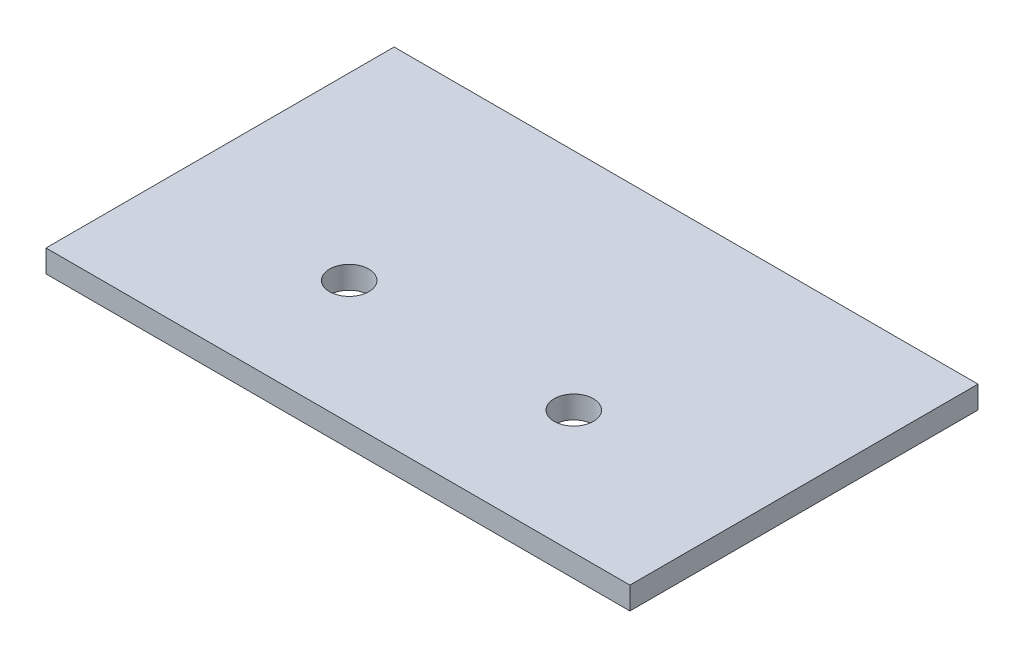
ISO-10303-21;
HEADER;
FILE_DESCRIPTION(('STEP AP214'),'2;1');
FILE_NAME('part.step','',(''),(''),'','','');
FILE_SCHEMA(('AUTOMOTIVE_DESIGN { 1 0 10303 214 1 1 1 1 }'));
ENDSEC;
DATA;
#1=APPLICATION_CONTEXT('core data for automotive mechanical design processes');
#2=APPLICATION_PROTOCOL_DEFINITION('international standard','automotive_design',2000,#1);
#3=PRODUCT_CONTEXT('',#1,'mechanical');
#4=PRODUCT('Part','Part','',(#3));
#5=PRODUCT_RELATED_PRODUCT_CATEGORY('part','',(#4));
#6=PRODUCT_DEFINITION_FORMATION('','',#4);
#7=PRODUCT_DEFINITION_CONTEXT('part definition',#1,'design');
#8=PRODUCT_DEFINITION('design','',#6,#7);
#9=PRODUCT_DEFINITION_SHAPE('','',#8);
#10=(LENGTH_UNIT() NAMED_UNIT(*) SI_UNIT(.MILLI.,.METRE.));
#11=(NAMED_UNIT(*) PLANE_ANGLE_UNIT() SI_UNIT($,.RADIAN.));
#12=(NAMED_UNIT(*) SI_UNIT($,.STERADIAN.) SOLID_ANGLE_UNIT());
#13=UNCERTAINTY_MEASURE_WITH_UNIT(LENGTH_MEASURE(1.E-05),#10,'distance_accuracy_value','');
#14=(GEOMETRIC_REPRESENTATION_CONTEXT(3) GLOBAL_UNCERTAINTY_ASSIGNED_CONTEXT((#13)) GLOBAL_UNIT_ASSIGNED_CONTEXT((#10,
#11,#12)) REPRESENTATION_CONTEXT('',''));
#15=CARTESIAN_POINT('',(0.,0.,0.));
#16=DIRECTION('',(0.,0.,1.));
#17=DIRECTION('',(1.,0.,0.));
#18=AXIS2_PLACEMENT_3D('',#15,#16,#17);
#19=CARTESIAN_POINT('',(0.,2.,0.));
#20=DIRECTION('',(0.,1.,0.));
#21=DIRECTION('',(0.,0.,1.));
#22=AXIS2_PLACEMENT_3D('',#19,#20,#21);
#23=PLANE('',#22);
#24=CARTESIAN_POINT('',(-10.,2.,4.5));
#25=DIRECTION('',(0.,1.,0.));
#26=DIRECTION('',(0.,0.,1.));
#27=AXIS2_PLACEMENT_3D('',#24,#25,#26);
#28=CIRCLE('',#27,1.75);
#29=CARTESIAN_POINT('',(-10.,2.,6.25));
#30=VERTEX_POINT('',#29);
#31=EDGE_CURVE('E99',#30,#30,#28,.T.);
#32=ORIENTED_EDGE('',*,*,#31,.F.);
#33=EDGE_LOOP('',(#32));
#34=FACE_BOUND('',#33,.T.);
#35=DIRECTION('',(0.,0.,-1.));
#36=VECTOR('',#35,1.);
#37=CARTESIAN_POINT('',(26.,2.,-15.5));
#38=LINE('',#37,#36);
#39=CARTESIAN_POINT('',(26.,2.,15.5));
#40=VERTEX_POINT('',#39);
#41=CARTESIAN_POINT('',(26.,2.,-15.5));
#42=VERTEX_POINT('',#41);
#43=EDGE_CURVE('E84',#40,#42,#38,.T.);
#44=ORIENTED_EDGE('',*,*,#43,.T.);
#45=DIRECTION('',(-1.,0.,0.));
#46=VECTOR('',#45,1.);
#47=CARTESIAN_POINT('',(-26.,2.,-15.5));
#48=LINE('',#47,#46);
#49=CARTESIAN_POINT('',(-26.,2.,-15.5));
#50=VERTEX_POINT('',#49);
#51=EDGE_CURVE('E79',#42,#50,#48,.T.);
#52=ORIENTED_EDGE('',*,*,#51,.T.);
#53=DIRECTION('',(0.,0.,1.));
#54=VECTOR('',#53,1.);
#55=CARTESIAN_POINT('',(-26.,2.,-15.5));
#56=LINE('',#55,#54);
#57=CARTESIAN_POINT('',(-26.,2.,15.5));
#58=VERTEX_POINT('',#57);
#59=EDGE_CURVE('E82',#50,#58,#56,.T.);
#60=ORIENTED_EDGE('',*,*,#59,.T.);
#61=DIRECTION('',(1.,0.,0.));
#62=VECTOR('',#61,1.);
#63=CARTESIAN_POINT('',(-26.,2.,15.5));
#64=LINE('',#63,#62);
#65=EDGE_CURVE('E49',#58,#40,#64,.T.);
#66=ORIENTED_EDGE('',*,*,#65,.T.);
#67=EDGE_LOOP('',(#44,#52,#60,#66));
#68=FACE_BOUND('',#67,.T.);
#69=CARTESIAN_POINT('',(10.,2.,4.5));
#70=DIRECTION('',(0.,1.,0.));
#71=DIRECTION('',(0.,0.,1.));
#72=AXIS2_PLACEMENT_3D('',#69,#70,#71);
#73=CIRCLE('',#72,1.75);
#74=CARTESIAN_POINT('',(10.,2.,6.25));
#75=VERTEX_POINT('',#74);
#76=EDGE_CURVE('E114',#75,#75,#73,.T.);
#77=ORIENTED_EDGE('',*,*,#76,.F.);
#78=EDGE_LOOP('',(#77));
#79=FACE_BOUND('',#78,.T.);
#80=ADVANCED_FACE('F32',(#34,#68,#79),#23,.T.);
#81=CARTESIAN_POINT('',(0.,0.,0.));
#82=DIRECTION('',(0.,1.,0.));
#83=DIRECTION('',(0.,0.,1.));
#84=AXIS2_PLACEMENT_3D('',#81,#82,#83);
#85=PLANE('',#84);
#86=DIRECTION('',(0.,0.,-1.));
#87=VECTOR('',#86,1.);
#88=CARTESIAN_POINT('',(26.,0.,-15.5));
#89=LINE('',#88,#87);
#90=CARTESIAN_POINT('',(26.,0.,15.5));
#91=VERTEX_POINT('',#90);
#92=CARTESIAN_POINT('',(26.,0.,-15.5));
#93=VERTEX_POINT('',#92);
#94=EDGE_CURVE('E96',#91,#93,#89,.T.);
#95=ORIENTED_EDGE('',*,*,#94,.F.);
#96=DIRECTION('',(1.,0.,0.));
#97=VECTOR('',#96,1.);
#98=CARTESIAN_POINT('',(-26.,0.,15.5));
#99=LINE('',#98,#97);
#100=CARTESIAN_POINT('',(-26.,0.,15.5));
#101=VERTEX_POINT('',#100);
#102=EDGE_CURVE('E72',#101,#91,#99,.T.);
#103=ORIENTED_EDGE('',*,*,#102,.F.);
#104=DIRECTION('',(0.,0.,1.));
#105=VECTOR('',#104,1.);
#106=CARTESIAN_POINT('',(-26.,0.,-15.5));
#107=LINE('',#106,#105);
#108=CARTESIAN_POINT('',(-26.,0.,-15.5));
#109=VERTEX_POINT('',#108);
#110=EDGE_CURVE('E66',#109,#101,#107,.T.);
#111=ORIENTED_EDGE('',*,*,#110,.F.);
#112=DIRECTION('',(-1.,0.,0.));
#113=VECTOR('',#112,1.);
#114=CARTESIAN_POINT('',(-26.,0.,-15.5));
#115=LINE('',#114,#113);
#116=EDGE_CURVE('E88',#93,#109,#115,.T.);
#117=ORIENTED_EDGE('',*,*,#116,.F.);
#118=EDGE_LOOP('',(#95,#103,#111,#117));
#119=FACE_BOUND('',#118,.T.);
#120=CARTESIAN_POINT('',(-10.,0.,4.5));
#121=DIRECTION('',(0.,1.,0.));
#122=DIRECTION('',(0.,0.,1.));
#123=AXIS2_PLACEMENT_3D('',#120,#121,#122);
#124=CIRCLE('',#123,1.75);
#125=CARTESIAN_POINT('',(-10.,0.,6.25));
#126=VERTEX_POINT('',#125);
#127=EDGE_CURVE('E111',#126,#126,#124,.T.);
#128=ORIENTED_EDGE('',*,*,#127,.T.);
#129=EDGE_LOOP('',(#128));
#130=FACE_BOUND('',#129,.T.);
#131=CARTESIAN_POINT('',(10.,0.,4.5));
#132=DIRECTION('',(0.,1.,0.));
#133=DIRECTION('',(0.,0.,1.));
#134=AXIS2_PLACEMENT_3D('',#131,#132,#133);
#135=CIRCLE('',#134,1.75);
#136=CARTESIAN_POINT('',(10.,0.,6.25));
#137=VERTEX_POINT('',#136);
#138=EDGE_CURVE('E117',#137,#137,#135,.T.);
#139=ORIENTED_EDGE('',*,*,#138,.T.);
#140=EDGE_LOOP('',(#139));
#141=FACE_BOUND('',#140,.T.);
#142=ADVANCED_FACE('F107',(#119,#130,#141),#85,.F.);
#143=CARTESIAN_POINT('',(26.,2.,-15.5));
#144=DIRECTION('',(-1.,0.,0.));
#145=DIRECTION('',(0.,0.,1.));
#146=AXIS2_PLACEMENT_3D('',#143,#144,#145);
#147=PLANE('',#146);
#148=ORIENTED_EDGE('',*,*,#94,.T.);
#149=DIRECTION('',(0.,-1.,0.));
#150=VECTOR('',#149,1.);
#151=CARTESIAN_POINT('',(26.,2.,-15.5));
#152=LINE('',#151,#150);
#153=EDGE_CURVE('E11',#42,#93,#152,.T.);
#154=ORIENTED_EDGE('',*,*,#153,.F.);
#155=ORIENTED_EDGE('',*,*,#43,.F.);
#156=DIRECTION('',(0.,-1.,0.));
#157=VECTOR('',#156,1.);
#158=CARTESIAN_POINT('',(26.,2.,15.5));
#159=LINE('',#158,#157);
#160=EDGE_CURVE('E92',#40,#91,#159,.T.);
#161=ORIENTED_EDGE('',*,*,#160,.T.);
#162=EDGE_LOOP('',(#148,#154,#155,#161));
#163=FACE_BOUND('',#162,.T.);
#164=ADVANCED_FACE('F34',(#163),#147,.F.);
#165=CARTESIAN_POINT('',(-26.,2.,-15.5));
#166=DIRECTION('',(0.,0.,1.));
#167=DIRECTION('',(1.,0.,0.));
#168=AXIS2_PLACEMENT_3D('',#165,#166,#167);
#169=PLANE('',#168);
#170=ORIENTED_EDGE('',*,*,#116,.T.);
#171=DIRECTION('',(0.,-1.,0.));
#172=VECTOR('',#171,1.);
#173=CARTESIAN_POINT('',(-26.,2.,-15.5));
#174=LINE('',#173,#172);
#175=EDGE_CURVE('E41',#50,#109,#174,.T.);
#176=ORIENTED_EDGE('',*,*,#175,.F.);
#177=ORIENTED_EDGE('',*,*,#51,.F.);
#178=ORIENTED_EDGE('',*,*,#153,.T.);
#179=EDGE_LOOP('',(#170,#176,#177,#178));
#180=FACE_BOUND('',#179,.T.);
#181=ADVANCED_FACE('F87',(#180),#169,.F.);
#182=CARTESIAN_POINT('',(-26.,2.,-15.5));
#183=DIRECTION('',(1.,0.,0.));
#184=DIRECTION('',(0.,0.,-1.));
#185=AXIS2_PLACEMENT_3D('',#182,#183,#184);
#186=PLANE('',#185);
#187=ORIENTED_EDGE('',*,*,#110,.T.);
#188=DIRECTION('',(0.,-1.,0.));
#189=VECTOR('',#188,1.);
#190=CARTESIAN_POINT('',(-26.,2.,15.5));
#191=LINE('',#190,#189);
#192=EDGE_CURVE('E89',#58,#101,#191,.T.);
#193=ORIENTED_EDGE('',*,*,#192,.F.);
#194=ORIENTED_EDGE('',*,*,#59,.F.);
#195=ORIENTED_EDGE('',*,*,#175,.T.);
#196=EDGE_LOOP('',(#187,#193,#194,#195));
#197=FACE_BOUND('',#196,.T.);
#198=ADVANCED_FACE('F90',(#197),#186,.F.);
#199=CARTESIAN_POINT('',(-26.,2.,15.5));
#200=DIRECTION('',(0.,0.,-1.));
#201=DIRECTION('',(-1.,0.,0.));
#202=AXIS2_PLACEMENT_3D('',#199,#200,#201);
#203=PLANE('',#202);
#204=ORIENTED_EDGE('',*,*,#102,.T.);
#205=ORIENTED_EDGE('',*,*,#160,.F.);
#206=ORIENTED_EDGE('',*,*,#65,.F.);
#207=ORIENTED_EDGE('',*,*,#192,.T.);
#208=EDGE_LOOP('',(#204,#205,#206,#207));
#209=FACE_BOUND('',#208,.T.);
#210=ADVANCED_FACE('F104',(#209),#203,.F.);
#211=CARTESIAN_POINT('',(-10.,2.,4.5));
#212=DIRECTION('',(0.,-1.,0.));
#213=DIRECTION('',(0.,0.,-1.));
#214=AXIS2_PLACEMENT_3D('',#211,#212,#213);
#215=CYLINDRICAL_SURFACE('',#214,1.75);
#216=ORIENTED_EDGE('',*,*,#31,.T.);
#217=EDGE_LOOP('',(#216));
#218=FACE_BOUND('',#217,.T.);
#219=ORIENTED_EDGE('',*,*,#127,.F.);
#220=EDGE_LOOP('',(#219));
#221=FACE_BOUND('',#220,.T.);
#222=ADVANCED_FACE('F134',(#218,#221),#215,.F.);
#223=CARTESIAN_POINT('',(10.,2.,4.5));
#224=DIRECTION('',(0.,-1.,0.));
#225=DIRECTION('',(0.,0.,-1.));
#226=AXIS2_PLACEMENT_3D('',#223,#224,#225);
#227=CYLINDRICAL_SURFACE('',#226,1.75);
#228=ORIENTED_EDGE('',*,*,#76,.T.);
#229=EDGE_LOOP('',(#228));
#230=FACE_BOUND('',#229,.T.);
#231=ORIENTED_EDGE('',*,*,#138,.F.);
#232=EDGE_LOOP('',(#231));
#233=FACE_BOUND('',#232,.T.);
#234=ADVANCED_FACE('F123',(#230,#233),#227,.F.);
#235=CLOSED_SHELL('',(#80,#142,#164,#181,#198,#210,#222,#234));
#236=MANIFOLD_SOLID_BREP('B2',#235);
#237=ADVANCED_BREP_SHAPE_REPRESENTATION('',(#18,#236),#14);
#238=SHAPE_DEFINITION_REPRESENTATION(#9,#237);
ENDSEC;
END-ISO-10303-21;
